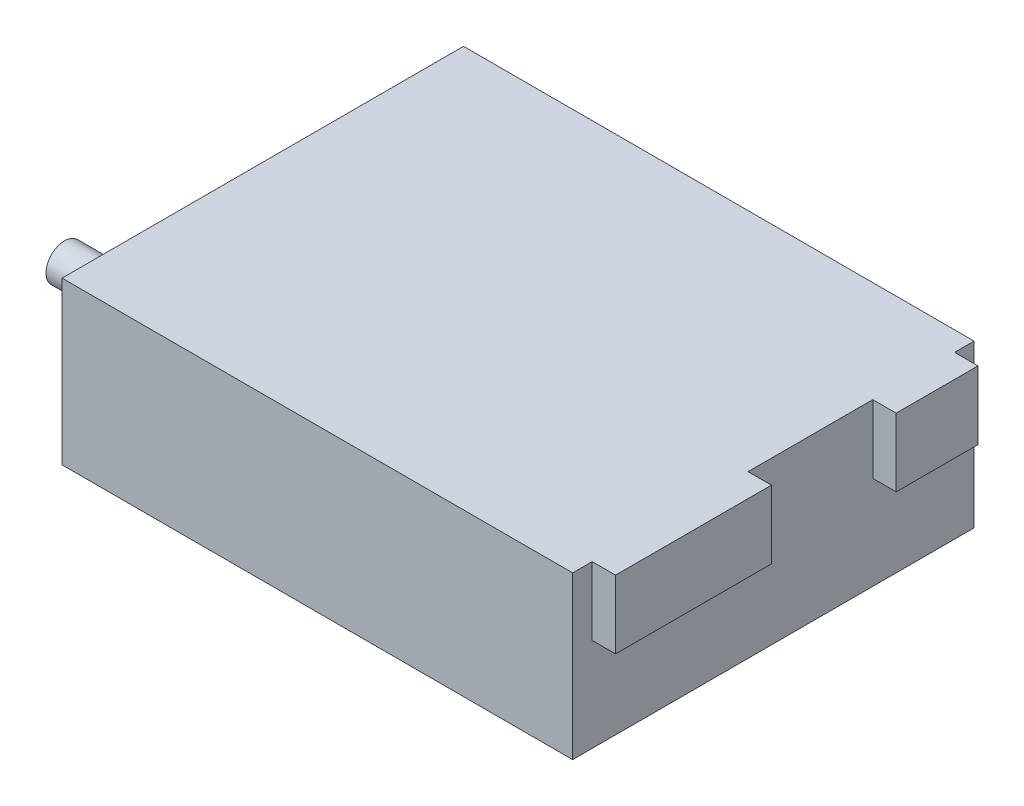
ISO-10303-21;
HEADER;
FILE_DESCRIPTION(('STEP AP214'),'2;1');
FILE_NAME('part.step','',(''),(''),'','','');
FILE_SCHEMA(('AUTOMOTIVE_DESIGN { 1 0 10303 214 1 1 1 1 }'));
ENDSEC;
DATA;
#1=APPLICATION_CONTEXT('core data for automotive mechanical design processes');
#2=APPLICATION_PROTOCOL_DEFINITION('international standard','automotive_design',2000,#1);
#3=PRODUCT_CONTEXT('',#1,'mechanical');
#4=PRODUCT('Part','Part','',(#3));
#5=PRODUCT_RELATED_PRODUCT_CATEGORY('part','',(#4));
#6=PRODUCT_DEFINITION_FORMATION('','',#4);
#7=PRODUCT_DEFINITION_CONTEXT('part definition',#1,'design');
#8=PRODUCT_DEFINITION('design','',#6,#7);
#9=PRODUCT_DEFINITION_SHAPE('','',#8);
#10=(LENGTH_UNIT() NAMED_UNIT(*) SI_UNIT(.MILLI.,.METRE.));
#11=(NAMED_UNIT(*) PLANE_ANGLE_UNIT() SI_UNIT($,.RADIAN.));
#12=(NAMED_UNIT(*) SI_UNIT($,.STERADIAN.) SOLID_ANGLE_UNIT());
#13=UNCERTAINTY_MEASURE_WITH_UNIT(LENGTH_MEASURE(1.E-05),#10,'distance_accuracy_value','');
#14=(GEOMETRIC_REPRESENTATION_CONTEXT(3) GLOBAL_UNCERTAINTY_ASSIGNED_CONTEXT((#13)) GLOBAL_UNIT_ASSIGNED_CONTEXT((#10,
#11,#12)) REPRESENTATION_CONTEXT('',''));
#15=CARTESIAN_POINT('',(0.,0.,0.));
#16=DIRECTION('',(0.,0.,1.));
#17=DIRECTION('',(1.,0.,0.));
#18=AXIS2_PLACEMENT_3D('',#15,#16,#17);
#19=CARTESIAN_POINT('',(13.1,8.3,-10.3));
#20=DIRECTION('',(-1.,0.,0.));
#21=DIRECTION('',(0.,0.,1.));
#22=AXIS2_PLACEMENT_3D('',#19,#20,#21);
#23=PLANE('',#22);
#24=DIRECTION('',(0.,1.,0.));
#25=VECTOR('',#24,1.);
#26=CARTESIAN_POINT('',(13.1,8.3,-9.3));
#27=LINE('',#26,#25);
#28=CARTESIAN_POINT('',(13.1,4.8,-9.3));
#29=VERTEX_POINT('',#28);
#30=CARTESIAN_POINT('',(13.1,8.3,-9.3));
#31=VERTEX_POINT('',#30);
#32=EDGE_CURVE('E50',#29,#31,#27,.T.);
#33=ORIENTED_EDGE('',*,*,#32,.F.);
#34=DIRECTION('',(0.,0.,-1.));
#35=VECTOR('',#34,1.);
#36=CARTESIAN_POINT('',(13.1,4.8,-9.3));
#37=LINE('',#36,#35);
#38=CARTESIAN_POINT('',(13.1,4.8,-5.1));
#39=VERTEX_POINT('',#38);
#40=EDGE_CURVE('E143',#39,#29,#37,.T.);
#41=ORIENTED_EDGE('',*,*,#40,.F.);
#42=DIRECTION('',(0.,-1.,0.));
#43=VECTOR('',#42,1.);
#44=CARTESIAN_POINT('',(13.1,8.3,-5.1));
#45=LINE('',#44,#43);
#46=CARTESIAN_POINT('',(13.1,8.3,-5.1));
#47=VERTEX_POINT('',#46);
#48=EDGE_CURVE('E230',#47,#39,#45,.T.);
#49=ORIENTED_EDGE('',*,*,#48,.F.);
#50=DIRECTION('',(0.,0.,-1.));
#51=VECTOR('',#50,1.);
#52=CARTESIAN_POINT('',(13.1,8.3,-10.3));
#53=LINE('',#52,#51);
#54=CARTESIAN_POINT('',(13.1,8.3,1.3));
#55=VERTEX_POINT('',#54);
#56=EDGE_CURVE('E182',#55,#47,#53,.T.);
#57=ORIENTED_EDGE('',*,*,#56,.F.);
#58=DIRECTION('',(0.,1.,0.));
#59=VECTOR('',#58,1.);
#60=CARTESIAN_POINT('',(13.1,8.3,1.3));
#61=LINE('',#60,#59);
#62=CARTESIAN_POINT('',(13.1,4.8,1.3));
#63=VERTEX_POINT('',#62);
#64=EDGE_CURVE('E158',#63,#55,#61,.T.);
#65=ORIENTED_EDGE('',*,*,#64,.F.);
#66=DIRECTION('',(0.,0.,-1.));
#67=VECTOR('',#66,1.);
#68=CARTESIAN_POINT('',(13.1,4.8,9.3));
#69=LINE('',#68,#67);
#70=CARTESIAN_POINT('',(13.1,4.8,9.3));
#71=VERTEX_POINT('',#70);
#72=EDGE_CURVE('E58',#71,#63,#69,.T.);
#73=ORIENTED_EDGE('',*,*,#72,.F.);
#74=DIRECTION('',(0.,-1.,0.));
#75=VECTOR('',#74,1.);
#76=CARTESIAN_POINT('',(13.1,8.3,9.3));
#77=LINE('',#76,#75);
#78=CARTESIAN_POINT('',(13.1,8.3,9.3));
#79=VERTEX_POINT('',#78);
#80=EDGE_CURVE('E146',#79,#71,#77,.T.);
#81=ORIENTED_EDGE('',*,*,#80,.F.);
#82=CARTESIAN_POINT('',(13.1,8.3,10.3));
#83=VERTEX_POINT('',#82);
#84=EDGE_CURVE('E179',#83,#79,#53,.T.);
#85=ORIENTED_EDGE('',*,*,#84,.F.);
#86=DIRECTION('',(0.,-1.,0.));
#87=VECTOR('',#86,1.);
#88=CARTESIAN_POINT('',(13.1,8.3,10.3));
#89=LINE('',#88,#87);
#90=CARTESIAN_POINT('',(13.1,0.,10.3));
#91=VERTEX_POINT('',#90);
#92=EDGE_CURVE('E189',#83,#91,#89,.T.);
#93=ORIENTED_EDGE('',*,*,#92,.T.);
#94=DIRECTION('',(0.,0.,-1.));
#95=VECTOR('',#94,1.);
#96=CARTESIAN_POINT('',(13.1,0.,-10.3));
#97=LINE('',#96,#95);
#98=CARTESIAN_POINT('',(13.1,0.,-10.3));
#99=VERTEX_POINT('',#98);
#100=EDGE_CURVE('E178',#91,#99,#97,.T.);
#101=ORIENTED_EDGE('',*,*,#100,.T.);
#102=DIRECTION('',(0.,-1.,0.));
#103=VECTOR('',#102,1.);
#104=CARTESIAN_POINT('',(13.1,8.3,-10.3));
#105=LINE('',#104,#103);
#106=CARTESIAN_POINT('',(13.1,8.3,-10.3));
#107=VERTEX_POINT('',#106);
#108=EDGE_CURVE('E43',#107,#99,#105,.T.);
#109=ORIENTED_EDGE('',*,*,#108,.F.);
#110=EDGE_CURVE('E183',#31,#107,#53,.T.);
#111=ORIENTED_EDGE('',*,*,#110,.F.);
#112=EDGE_LOOP('',(#33,#41,#49,#57,#65,#73,#81,#85,#93,#101,#109,#111));
#113=FACE_BOUND('',#112,.T.);
#114=ADVANCED_FACE('F36',(#113),#23,.F.);
#115=CARTESIAN_POINT('',(-13.1,8.3,-10.3));
#116=DIRECTION('',(0.,0.,1.));
#117=DIRECTION('',(1.,0.,0.));
#118=AXIS2_PLACEMENT_3D('',#115,#116,#117);
#119=PLANE('',#118);
#120=DIRECTION('',(-1.,0.,0.));
#121=VECTOR('',#120,1.);
#122=CARTESIAN_POINT('',(-13.1,0.,-10.3));
#123=LINE('',#122,#121);
#124=CARTESIAN_POINT('',(-13.1,0.,-10.3));
#125=VERTEX_POINT('',#124);
#126=EDGE_CURVE('E192',#99,#125,#123,.T.);
#127=ORIENTED_EDGE('',*,*,#126,.T.);
#128=DIRECTION('',(0.,-1.,0.));
#129=VECTOR('',#128,1.);
#130=CARTESIAN_POINT('',(-13.1,8.3,-10.3));
#131=LINE('',#130,#129);
#132=CARTESIAN_POINT('',(-13.1,8.3,-10.3));
#133=VERTEX_POINT('',#132);
#134=EDGE_CURVE('E203',#133,#125,#131,.T.);
#135=ORIENTED_EDGE('',*,*,#134,.F.);
#136=DIRECTION('',(-1.,0.,0.));
#137=VECTOR('',#136,1.);
#138=CARTESIAN_POINT('',(-13.1,8.3,-10.3));
#139=LINE('',#138,#137);
#140=EDGE_CURVE('E181',#107,#133,#139,.T.);
#141=ORIENTED_EDGE('',*,*,#140,.F.);
#142=ORIENTED_EDGE('',*,*,#108,.T.);
#143=EDGE_LOOP('',(#127,#135,#141,#142));
#144=FACE_BOUND('',#143,.T.);
#145=ADVANCED_FACE('F209',(#144),#119,.F.);
#146=CARTESIAN_POINT('',(-13.1,8.3,-10.3));
#147=DIRECTION('',(1.,0.,0.));
#148=DIRECTION('',(0.,0.,-1.));
#149=AXIS2_PLACEMENT_3D('',#146,#147,#148);
#150=PLANE('',#149);
#151=CARTESIAN_POINT('',(-13.1,3.94531961404709,5.17483726866886));
#152=DIRECTION('',(1.,0.,0.));
#153=DIRECTION('',(0.,0.,-1.));
#154=AXIS2_PLACEMENT_3D('',#151,#152,#153);
#155=CIRCLE('',#154,0.95);
#156=CARTESIAN_POINT('',(-13.1,3.94531961404709,4.22483726866886));
#157=VERTEX_POINT('',#156);
#158=EDGE_CURVE('E11',#157,#157,#155,.F.);
#159=ORIENTED_EDGE('',*,*,#158,.F.);
#160=EDGE_LOOP('',(#159));
#161=FACE_BOUND('',#160,.T.);
#162=DIRECTION('',(0.,0.,1.));
#163=VECTOR('',#162,1.);
#164=CARTESIAN_POINT('',(-13.1,0.,-10.3));
#165=LINE('',#164,#163);
#166=CARTESIAN_POINT('',(-13.1,0.,10.3));
#167=VERTEX_POINT('',#166);
#168=EDGE_CURVE('E194',#125,#167,#165,.T.);
#169=ORIENTED_EDGE('',*,*,#168,.T.);
#170=DIRECTION('',(0.,-1.,0.));
#171=VECTOR('',#170,1.);
#172=CARTESIAN_POINT('',(-13.1,8.3,10.3));
#173=LINE('',#172,#171);
#174=CARTESIAN_POINT('',(-13.1,8.3,10.3));
#175=VERTEX_POINT('',#174);
#176=EDGE_CURVE('E200',#175,#167,#173,.T.);
#177=ORIENTED_EDGE('',*,*,#176,.F.);
#178=DIRECTION('',(0.,0.,1.));
#179=VECTOR('',#178,1.);
#180=CARTESIAN_POINT('',(-13.1,8.3,-10.3));
#181=LINE('',#180,#179);
#182=EDGE_CURVE('E185',#133,#175,#181,.T.);
#183=ORIENTED_EDGE('',*,*,#182,.F.);
#184=ORIENTED_EDGE('',*,*,#134,.T.);
#185=EDGE_LOOP('',(#169,#177,#183,#184));
#186=FACE_BOUND('',#185,.T.);
#187=ADVANCED_FACE('F220',(#161,#186),#150,.F.);
#188=CARTESIAN_POINT('',(-13.1,8.3,10.3));
#189=DIRECTION('',(0.,0.,-1.));
#190=DIRECTION('',(-1.,0.,0.));
#191=AXIS2_PLACEMENT_3D('',#188,#189,#190);
#192=PLANE('',#191);
#193=DIRECTION('',(1.,0.,0.));
#194=VECTOR('',#193,1.);
#195=CARTESIAN_POINT('',(-13.1,0.,10.3));
#196=LINE('',#195,#194);
#197=EDGE_CURVE('E196',#167,#91,#196,.T.);
#198=ORIENTED_EDGE('',*,*,#197,.T.);
#199=ORIENTED_EDGE('',*,*,#92,.F.);
#200=DIRECTION('',(1.,0.,0.));
#201=VECTOR('',#200,1.);
#202=CARTESIAN_POINT('',(-13.1,8.3,10.3));
#203=LINE('',#202,#201);
#204=EDGE_CURVE('E187',#175,#83,#203,.T.);
#205=ORIENTED_EDGE('',*,*,#204,.F.);
#206=ORIENTED_EDGE('',*,*,#176,.T.);
#207=EDGE_LOOP('',(#198,#199,#205,#206));
#208=FACE_BOUND('',#207,.T.);
#209=ADVANCED_FACE('F224',(#208),#192,.F.);
#210=CARTESIAN_POINT('',(0.,8.3,0.));
#211=DIRECTION('',(0.,1.,0.));
#212=DIRECTION('',(0.,0.,1.));
#213=AXIS2_PLACEMENT_3D('',#210,#211,#212);
#214=PLANE('',#213);
#215=ORIENTED_EDGE('',*,*,#84,.T.);
#216=DIRECTION('',(-1.,0.,0.));
#217=VECTOR('',#216,1.);
#218=CARTESIAN_POINT('',(14.3,8.3,9.3));
#219=LINE('',#218,#217);
#220=CARTESIAN_POINT('',(14.3,8.3,9.3));
#221=VERTEX_POINT('',#220);
#222=EDGE_CURVE('E163',#221,#79,#219,.T.);
#223=ORIENTED_EDGE('',*,*,#222,.F.);
#224=DIRECTION('',(0.,0.,1.));
#225=VECTOR('',#224,1.);
#226=CARTESIAN_POINT('',(14.3,8.3,9.3));
#227=LINE('',#226,#225);
#228=CARTESIAN_POINT('',(14.3,8.3,1.3));
#229=VERTEX_POINT('',#228);
#230=EDGE_CURVE('E162',#229,#221,#227,.T.);
#231=ORIENTED_EDGE('',*,*,#230,.F.);
#232=DIRECTION('',(-1.,0.,0.));
#233=VECTOR('',#232,1.);
#234=CARTESIAN_POINT('',(14.3,8.3,1.3));
#235=LINE('',#234,#233);
#236=EDGE_CURVE('E170',#229,#55,#235,.T.);
#237=ORIENTED_EDGE('',*,*,#236,.T.);
#238=ORIENTED_EDGE('',*,*,#56,.T.);
#239=DIRECTION('',(-1.,0.,0.));
#240=VECTOR('',#239,1.);
#241=CARTESIAN_POINT('',(14.3,8.3,-5.1));
#242=LINE('',#241,#240);
#243=CARTESIAN_POINT('',(14.3,8.3,-5.1));
#244=VERTEX_POINT('',#243);
#245=EDGE_CURVE('E132',#244,#47,#242,.T.);
#246=ORIENTED_EDGE('',*,*,#245,.F.);
#247=DIRECTION('',(0.,0.,1.));
#248=VECTOR('',#247,1.);
#249=CARTESIAN_POINT('',(14.3,8.3,-9.3));
#250=LINE('',#249,#248);
#251=CARTESIAN_POINT('',(14.3,8.3,-9.3));
#252=VERTEX_POINT('',#251);
#253=EDGE_CURVE('E125',#252,#244,#250,.T.);
#254=ORIENTED_EDGE('',*,*,#253,.F.);
#255=DIRECTION('',(-1.,0.,0.));
#256=VECTOR('',#255,1.);
#257=CARTESIAN_POINT('',(14.3,8.3,-9.3));
#258=LINE('',#257,#256);
#259=EDGE_CURVE('E129',#252,#31,#258,.T.);
#260=ORIENTED_EDGE('',*,*,#259,.T.);
#261=ORIENTED_EDGE('',*,*,#110,.T.);
#262=ORIENTED_EDGE('',*,*,#140,.T.);
#263=ORIENTED_EDGE('',*,*,#182,.T.);
#264=ORIENTED_EDGE('',*,*,#204,.T.);
#265=EDGE_LOOP('',(#215,#223,#231,#237,#238,#246,#254,#260,#261,#262,#263,#264));
#266=FACE_BOUND('',#265,.T.);
#267=ADVANCED_FACE('F128',(#266),#214,.T.);
#268=CARTESIAN_POINT('',(0.,0.,0.));
#269=DIRECTION('',(0.,1.,0.));
#270=DIRECTION('',(0.,0.,1.));
#271=AXIS2_PLACEMENT_3D('',#268,#269,#270);
#272=PLANE('',#271);
#273=ORIENTED_EDGE('',*,*,#100,.F.);
#274=ORIENTED_EDGE('',*,*,#197,.F.);
#275=ORIENTED_EDGE('',*,*,#168,.F.);
#276=ORIENTED_EDGE('',*,*,#126,.F.);
#277=EDGE_LOOP('',(#273,#274,#275,#276));
#278=FACE_BOUND('',#277,.T.);
#279=ADVANCED_FACE('F216',(#278),#272,.F.);
#280=CARTESIAN_POINT('',(14.3,8.3,9.3));
#281=DIRECTION('',(0.,0.,-1.));
#282=DIRECTION('',(0.,1.,0.));
#283=AXIS2_PLACEMENT_3D('',#280,#281,#282);
#284=PLANE('',#283);
#285=ORIENTED_EDGE('',*,*,#80,.T.);
#286=DIRECTION('',(-1.,0.,0.));
#287=VECTOR('',#286,1.);
#288=CARTESIAN_POINT('',(14.3,4.8,9.3));
#289=LINE('',#288,#287);
#290=CARTESIAN_POINT('',(14.3,4.8,9.3));
#291=VERTEX_POINT('',#290);
#292=EDGE_CURVE('E176',#291,#71,#289,.T.);
#293=ORIENTED_EDGE('',*,*,#292,.F.);
#294=DIRECTION('',(0.,-1.,0.));
#295=VECTOR('',#294,1.);
#296=CARTESIAN_POINT('',(14.3,8.3,9.3));
#297=LINE('',#296,#295);
#298=EDGE_CURVE('E154',#221,#291,#297,.T.);
#299=ORIENTED_EDGE('',*,*,#298,.F.);
#300=ORIENTED_EDGE('',*,*,#222,.T.);
#301=EDGE_LOOP('',(#285,#293,#299,#300));
#302=FACE_BOUND('',#301,.T.);
#303=ADVANCED_FACE('F240',(#302),#284,.F.);
#304=CARTESIAN_POINT('',(14.3,4.8,9.3));
#305=DIRECTION('',(0.,1.,0.));
#306=DIRECTION('',(0.,0.,1.));
#307=AXIS2_PLACEMENT_3D('',#304,#305,#306);
#308=PLANE('',#307);
#309=ORIENTED_EDGE('',*,*,#72,.T.);
#310=DIRECTION('',(-1.,0.,0.));
#311=VECTOR('',#310,1.);
#312=CARTESIAN_POINT('',(14.3,4.8,1.3));
#313=LINE('',#312,#311);
#314=CARTESIAN_POINT('',(14.3,4.8,1.3));
#315=VERTEX_POINT('',#314);
#316=EDGE_CURVE('E173',#315,#63,#313,.T.);
#317=ORIENTED_EDGE('',*,*,#316,.F.);
#318=DIRECTION('',(0.,0.,-1.));
#319=VECTOR('',#318,1.);
#320=CARTESIAN_POINT('',(14.3,4.8,9.3));
#321=LINE('',#320,#319);
#322=EDGE_CURVE('E157',#291,#315,#321,.T.);
#323=ORIENTED_EDGE('',*,*,#322,.F.);
#324=ORIENTED_EDGE('',*,*,#292,.T.);
#325=EDGE_LOOP('',(#309,#317,#323,#324));
#326=FACE_BOUND('',#325,.T.);
#327=ADVANCED_FACE('F236',(#326),#308,.F.);
#328=CARTESIAN_POINT('',(14.3,8.3,1.3));
#329=DIRECTION('',(0.,0.,1.));
#330=DIRECTION('',(1.,0.,0.));
#331=AXIS2_PLACEMENT_3D('',#328,#329,#330);
#332=PLANE('',#331);
#333=ORIENTED_EDGE('',*,*,#64,.T.);
#334=ORIENTED_EDGE('',*,*,#236,.F.);
#335=DIRECTION('',(0.,1.,0.));
#336=VECTOR('',#335,1.);
#337=CARTESIAN_POINT('',(14.3,8.3,1.3));
#338=LINE('',#337,#336);
#339=EDGE_CURVE('E160',#315,#229,#338,.T.);
#340=ORIENTED_EDGE('',*,*,#339,.F.);
#341=ORIENTED_EDGE('',*,*,#316,.T.);
#342=EDGE_LOOP('',(#333,#334,#340,#341));
#343=FACE_BOUND('',#342,.T.);
#344=ADVANCED_FACE('F232',(#343),#332,.F.);
#345=CARTESIAN_POINT('',(14.3,0.,0.));
#346=DIRECTION('',(1.,0.,0.));
#347=DIRECTION('',(0.,0.,-1.));
#348=AXIS2_PLACEMENT_3D('',#345,#346,#347);
#349=PLANE('',#348);
#350=ORIENTED_EDGE('',*,*,#298,.T.);
#351=ORIENTED_EDGE('',*,*,#322,.T.);
#352=ORIENTED_EDGE('',*,*,#339,.T.);
#353=ORIENTED_EDGE('',*,*,#230,.T.);
#354=EDGE_LOOP('',(#350,#351,#352,#353));
#355=FACE_BOUND('',#354,.T.);
#356=ADVANCED_FACE('F242',(#355),#349,.T.);
#357=CARTESIAN_POINT('',(14.3,8.3,-9.3));
#358=DIRECTION('',(0.,0.,1.));
#359=DIRECTION('',(0.,-1.,0.));
#360=AXIS2_PLACEMENT_3D('',#357,#358,#359);
#361=PLANE('',#360);
#362=ORIENTED_EDGE('',*,*,#32,.T.);
#363=ORIENTED_EDGE('',*,*,#259,.F.);
#364=DIRECTION('',(0.,1.,0.));
#365=VECTOR('',#364,1.);
#366=CARTESIAN_POINT('',(14.3,8.3,-9.3));
#367=LINE('',#366,#365);
#368=CARTESIAN_POINT('',(14.3,4.8,-9.3));
#369=VERTEX_POINT('',#368);
#370=EDGE_CURVE('E136',#369,#252,#367,.T.);
#371=ORIENTED_EDGE('',*,*,#370,.F.);
#372=DIRECTION('',(-1.,0.,0.));
#373=VECTOR('',#372,1.);
#374=CARTESIAN_POINT('',(14.3,4.8,-9.3));
#375=LINE('',#374,#373);
#376=EDGE_CURVE('E355',#369,#29,#375,.T.);
#377=ORIENTED_EDGE('',*,*,#376,.T.);
#378=EDGE_LOOP('',(#362,#363,#371,#377));
#379=FACE_BOUND('',#378,.T.);
#380=ADVANCED_FACE('F145',(#379),#361,.F.);
#381=CARTESIAN_POINT('',(14.3,8.3,-5.1));
#382=DIRECTION('',(0.,0.,-1.));
#383=DIRECTION('',(-1.,0.,0.));
#384=AXIS2_PLACEMENT_3D('',#381,#382,#383);
#385=PLANE('',#384);
#386=ORIENTED_EDGE('',*,*,#48,.T.);
#387=DIRECTION('',(-1.,0.,0.));
#388=VECTOR('',#387,1.);
#389=CARTESIAN_POINT('',(14.3,4.8,-5.1));
#390=LINE('',#389,#388);
#391=CARTESIAN_POINT('',(14.3,4.8,-5.1));
#392=VERTEX_POINT('',#391);
#393=EDGE_CURVE('E150',#392,#39,#390,.T.);
#394=ORIENTED_EDGE('',*,*,#393,.F.);
#395=DIRECTION('',(0.,-1.,0.));
#396=VECTOR('',#395,1.);
#397=CARTESIAN_POINT('',(14.3,8.3,-5.1));
#398=LINE('',#397,#396);
#399=EDGE_CURVE('E135',#244,#392,#398,.T.);
#400=ORIENTED_EDGE('',*,*,#399,.F.);
#401=ORIENTED_EDGE('',*,*,#245,.T.);
#402=EDGE_LOOP('',(#386,#394,#400,#401));
#403=FACE_BOUND('',#402,.T.);
#404=ADVANCED_FACE('F249',(#403),#385,.F.);
#405=CARTESIAN_POINT('',(14.3,4.8,-9.3));
#406=DIRECTION('',(0.,1.,0.));
#407=DIRECTION('',(0.,0.,1.));
#408=AXIS2_PLACEMENT_3D('',#405,#406,#407);
#409=PLANE('',#408);
#410=ORIENTED_EDGE('',*,*,#40,.T.);
#411=ORIENTED_EDGE('',*,*,#376,.F.);
#412=DIRECTION('',(0.,0.,-1.));
#413=VECTOR('',#412,1.);
#414=CARTESIAN_POINT('',(14.3,4.8,-9.3));
#415=LINE('',#414,#413);
#416=EDGE_CURVE('E141',#392,#369,#415,.T.);
#417=ORIENTED_EDGE('',*,*,#416,.F.);
#418=ORIENTED_EDGE('',*,*,#393,.T.);
#419=EDGE_LOOP('',(#410,#411,#417,#418));
#420=FACE_BOUND('',#419,.T.);
#421=ADVANCED_FACE('F298',(#420),#409,.F.);
#422=CARTESIAN_POINT('',(14.3,0.,0.));
#423=DIRECTION('',(-1.,0.,0.));
#424=DIRECTION('',(0.,0.,1.));
#425=AXIS2_PLACEMENT_3D('',#422,#423,#424);
#426=PLANE('',#425);
#427=ORIENTED_EDGE('',*,*,#370,.T.);
#428=ORIENTED_EDGE('',*,*,#253,.T.);
#429=ORIENTED_EDGE('',*,*,#399,.T.);
#430=ORIENTED_EDGE('',*,*,#416,.T.);
#431=EDGE_LOOP('',(#427,#428,#429,#430));
#432=FACE_BOUND('',#431,.T.);
#433=ADVANCED_FACE('F139',(#432),#426,.F.);
#434=CARTESIAN_POINT('',(-18.1,3.94531961404709,5.17483726866886));
#435=DIRECTION('',(1.,0.,0.));
#436=DIRECTION('',(0.,0.,-1.));
#437=AXIS2_PLACEMENT_3D('',#434,#435,#436);
#438=CYLINDRICAL_SURFACE('',#437,0.95);
#439=CARTESIAN_POINT('',(-18.1,3.94531961404709,5.17483726866886));
#440=DIRECTION('',(-1.,0.,0.));
#441=DIRECTION('',(0.,0.,1.));
#442=AXIS2_PLACEMENT_3D('',#439,#440,#441);
#443=CIRCLE('',#442,0.95);
#444=CARTESIAN_POINT('',(-18.1,3.94531961404709,6.12483726866886));
#445=VERTEX_POINT('',#444);
#446=EDGE_CURVE('E350',#445,#445,#443,.T.);
#447=ORIENTED_EDGE('',*,*,#446,.F.);
#448=EDGE_LOOP('',(#447));
#449=FACE_BOUND('',#448,.T.);
#450=ORIENTED_EDGE('',*,*,#158,.T.);
#451=EDGE_LOOP('',(#450));
#452=FACE_BOUND('',#451,.T.);
#453=ADVANCED_FACE('F317',(#449,#452),#438,.T.);
#454=CARTESIAN_POINT('',(-18.1,3.94531961404709,5.17483726866886));
#455=DIRECTION('',(-1.,0.,0.));
#456=DIRECTION('',(0.,0.,1.));
#457=AXIS2_PLACEMENT_3D('',#454,#455,#456);
#458=PLANE('',#457);
#459=ORIENTED_EDGE('',*,*,#446,.T.);
#460=EDGE_LOOP('',(#459));
#461=FACE_BOUND('',#460,.T.);
#462=ADVANCED_FACE('F334',(#461),#458,.T.);
#463=CLOSED_SHELL('',(#114,#145,#187,#209,#267,#279,#303,#327,#344,#356,#380,#404,#421,#433,
#453,#462));
#464=MANIFOLD_SOLID_BREP('B2',#463);
#465=ADVANCED_BREP_SHAPE_REPRESENTATION('',(#18,#464),#14);
#466=SHAPE_DEFINITION_REPRESENTATION(#9,#465);
ENDSEC;
END-ISO-10303-21;
